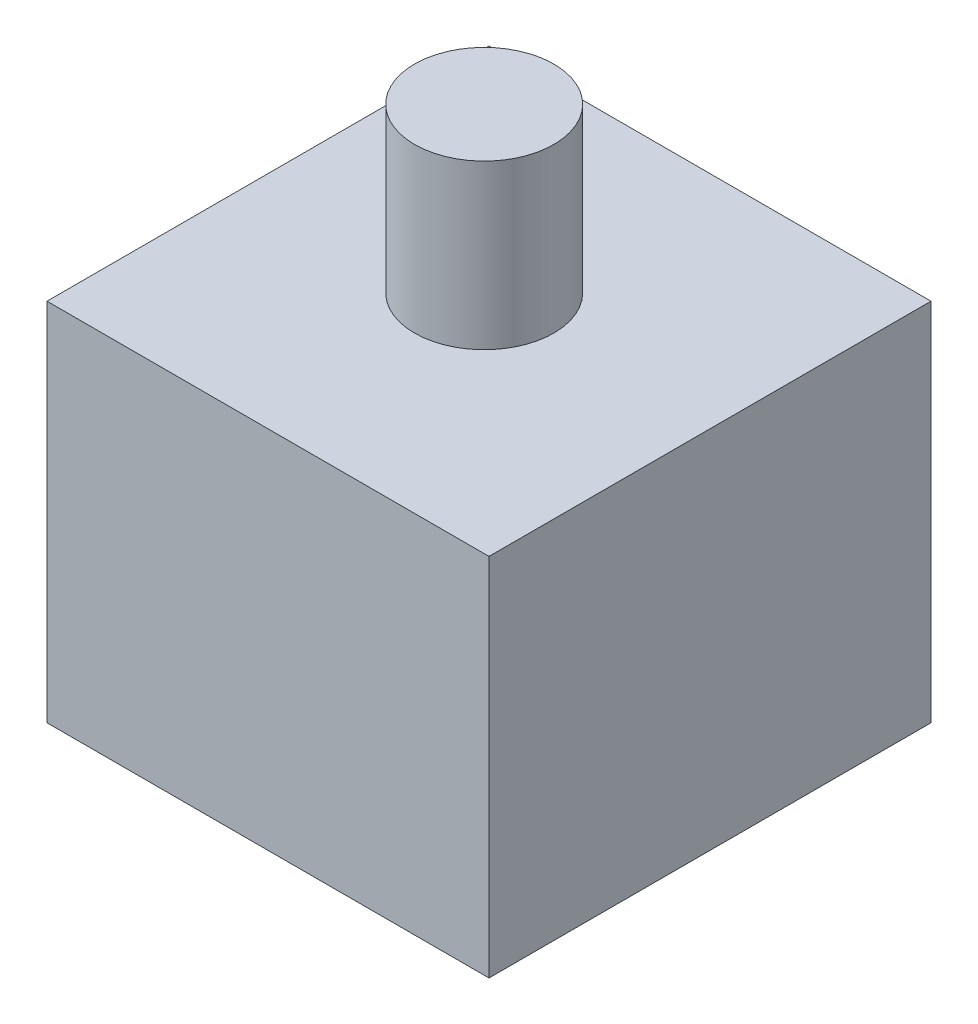
ISO-10303-21;
HEADER;
FILE_DESCRIPTION(('STEP AP214'),'2;1');
FILE_NAME('part.step','',(''),(''),'','','');
FILE_SCHEMA(('AUTOMOTIVE_DESIGN { 1 0 10303 214 1 1 1 1 }'));
ENDSEC;
DATA;
#1=APPLICATION_CONTEXT('core data for automotive mechanical design processes');
#2=APPLICATION_PROTOCOL_DEFINITION('international standard','automotive_design',2000,#1);
#3=PRODUCT_CONTEXT('',#1,'mechanical');
#4=PRODUCT('Part','Part','',(#3));
#5=PRODUCT_RELATED_PRODUCT_CATEGORY('part','',(#4));
#6=PRODUCT_DEFINITION_FORMATION('','',#4);
#7=PRODUCT_DEFINITION_CONTEXT('part definition',#1,'design');
#8=PRODUCT_DEFINITION('design','',#6,#7);
#9=PRODUCT_DEFINITION_SHAPE('','',#8);
#10=(LENGTH_UNIT() NAMED_UNIT(*) SI_UNIT(.MILLI.,.METRE.));
#11=(NAMED_UNIT(*) PLANE_ANGLE_UNIT() SI_UNIT($,.RADIAN.));
#12=(NAMED_UNIT(*) SI_UNIT($,.STERADIAN.) SOLID_ANGLE_UNIT());
#13=UNCERTAINTY_MEASURE_WITH_UNIT(LENGTH_MEASURE(1.E-05),#10,'distance_accuracy_value','');
#14=(GEOMETRIC_REPRESENTATION_CONTEXT(3) GLOBAL_UNCERTAINTY_ASSIGNED_CONTEXT((#13)) GLOBAL_UNIT_ASSIGNED_CONTEXT((#10,
#11,#12)) REPRESENTATION_CONTEXT('',''));
#15=CARTESIAN_POINT('',(0.,0.,0.));
#16=DIRECTION('',(0.,0.,1.));
#17=DIRECTION('',(1.,0.,0.));
#18=AXIS2_PLACEMENT_3D('',#15,#16,#17);
#19=CARTESIAN_POINT('',(-31.4333333333333,38.,-27.0633333333333));
#20=DIRECTION('',(-1.,0.,0.));
#21=DIRECTION('',(0.,0.,1.));
#22=AXIS2_PLACEMENT_3D('',#19,#20,#21);
#23=PLANE('',#22);
#24=DIRECTION('',(0.,0.,-1.));
#25=VECTOR('',#24,1.);
#26=CARTESIAN_POINT('',(-31.4333333333333,0.,-27.0633333333333));
#27=LINE('',#26,#25);
#28=CARTESIAN_POINT('',(-31.4333333333333,0.,18.9366666666667));
#29=VERTEX_POINT('',#28);
#30=CARTESIAN_POINT('',(-31.4333333333333,0.,-27.0633333333333));
#31=VERTEX_POINT('',#30);
#32=EDGE_CURVE('E99',#29,#31,#27,.T.);
#33=ORIENTED_EDGE('',*,*,#32,.T.);
#34=DIRECTION('',(0.,-1.,0.));
#35=VECTOR('',#34,1.);
#36=CARTESIAN_POINT('',(-31.4333333333333,38.,-27.0633333333333));
#37=LINE('',#36,#35);
#38=CARTESIAN_POINT('',(-31.4333333333333,38.,-27.0633333333333));
#39=VERTEX_POINT('',#38);
#40=EDGE_CURVE('E36',#39,#31,#37,.T.);
#41=ORIENTED_EDGE('',*,*,#40,.F.);
#42=DIRECTION('',(0.,0.,-1.));
#43=VECTOR('',#42,1.);
#44=CARTESIAN_POINT('',(-31.4333333333333,38.,-27.0633333333333));
#45=LINE('',#44,#43);
#46=CARTESIAN_POINT('',(-31.4333333333333,38.,18.9366666666667));
#47=VERTEX_POINT('',#46);
#48=EDGE_CURVE('E86',#47,#39,#45,.T.);
#49=ORIENTED_EDGE('',*,*,#48,.F.);
#50=DIRECTION('',(0.,-1.,0.));
#51=VECTOR('',#50,1.);
#52=CARTESIAN_POINT('',(-31.4333333333333,38.,18.9366666666667));
#53=LINE('',#52,#51);
#54=EDGE_CURVE('E95',#47,#29,#53,.T.);
#55=ORIENTED_EDGE('',*,*,#54,.T.);
#56=EDGE_LOOP('',(#33,#41,#49,#55));
#57=FACE_BOUND('',#56,.T.);
#58=ADVANCED_FACE('F33',(#57),#23,.F.);
#59=CARTESIAN_POINT('',(-77.4333333333333,38.,-27.0633333333333));
#60=DIRECTION('',(0.,0.,1.));
#61=DIRECTION('',(1.,0.,0.));
#62=AXIS2_PLACEMENT_3D('',#59,#60,#61);
#63=PLANE('',#62);
#64=DIRECTION('',(-1.,0.,0.));
#65=VECTOR('',#64,1.);
#66=CARTESIAN_POINT('',(-77.4333333333333,0.,-27.0633333333333));
#67=LINE('',#66,#65);
#68=CARTESIAN_POINT('',(-77.4333333333333,0.,-27.0633333333333));
#69=VERTEX_POINT('',#68);
#70=EDGE_CURVE('E91',#31,#69,#67,.T.);
#71=ORIENTED_EDGE('',*,*,#70,.T.);
#72=DIRECTION('',(0.,-1.,0.));
#73=VECTOR('',#72,1.);
#74=CARTESIAN_POINT('',(-77.4333333333333,38.,-27.0633333333333));
#75=LINE('',#74,#73);
#76=CARTESIAN_POINT('',(-77.4333333333333,38.,-27.0633333333333));
#77=VERTEX_POINT('',#76);
#78=EDGE_CURVE('E89',#77,#69,#75,.T.);
#79=ORIENTED_EDGE('',*,*,#78,.F.);
#80=DIRECTION('',(-1.,0.,0.));
#81=VECTOR('',#80,1.);
#82=CARTESIAN_POINT('',(-77.4333333333333,38.,-27.0633333333333));
#83=LINE('',#82,#81);
#84=EDGE_CURVE('E81',#39,#77,#83,.T.);
#85=ORIENTED_EDGE('',*,*,#84,.F.);
#86=ORIENTED_EDGE('',*,*,#40,.T.);
#87=EDGE_LOOP('',(#71,#79,#85,#86));
#88=FACE_BOUND('',#87,.T.);
#89=ADVANCED_FACE('F90',(#88),#63,.F.);
#90=CARTESIAN_POINT('',(-77.4333333333333,38.,-27.0633333333333));
#91=DIRECTION('',(1.,0.,0.));
#92=DIRECTION('',(0.,0.,-1.));
#93=AXIS2_PLACEMENT_3D('',#90,#91,#92);
#94=PLANE('',#93);
#95=DIRECTION('',(0.,0.,1.));
#96=VECTOR('',#95,1.);
#97=CARTESIAN_POINT('',(-77.4333333333333,0.,-27.0633333333333));
#98=LINE('',#97,#96);
#99=CARTESIAN_POINT('',(-77.4333333333333,0.,18.9366666666667));
#100=VERTEX_POINT('',#99);
#101=EDGE_CURVE('E67',#69,#100,#98,.T.);
#102=ORIENTED_EDGE('',*,*,#101,.T.);
#103=DIRECTION('',(0.,-1.,0.));
#104=VECTOR('',#103,1.);
#105=CARTESIAN_POINT('',(-77.4333333333333,38.,18.9366666666667));
#106=LINE('',#105,#104);
#107=CARTESIAN_POINT('',(-77.4333333333333,38.,18.9366666666667));
#108=VERTEX_POINT('',#107);
#109=EDGE_CURVE('E92',#108,#100,#106,.T.);
#110=ORIENTED_EDGE('',*,*,#109,.F.);
#111=DIRECTION('',(0.,0.,1.));
#112=VECTOR('',#111,1.);
#113=CARTESIAN_POINT('',(-77.4333333333333,38.,-27.0633333333333));
#114=LINE('',#113,#112);
#115=EDGE_CURVE('E84',#77,#108,#114,.T.);
#116=ORIENTED_EDGE('',*,*,#115,.F.);
#117=ORIENTED_EDGE('',*,*,#78,.T.);
#118=EDGE_LOOP('',(#102,#110,#116,#117));
#119=FACE_BOUND('',#118,.T.);
#120=ADVANCED_FACE('F93',(#119),#94,.F.);
#121=CARTESIAN_POINT('',(-77.4333333333333,38.,18.9366666666667));
#122=DIRECTION('',(0.,0.,-1.));
#123=DIRECTION('',(-1.,0.,0.));
#124=AXIS2_PLACEMENT_3D('',#121,#122,#123);
#125=PLANE('',#124);
#126=DIRECTION('',(1.,0.,0.));
#127=VECTOR('',#126,1.);
#128=CARTESIAN_POINT('',(-77.4333333333333,0.,18.9366666666667));
#129=LINE('',#128,#127);
#130=EDGE_CURVE('E73',#100,#29,#129,.T.);
#131=ORIENTED_EDGE('',*,*,#130,.T.);
#132=ORIENTED_EDGE('',*,*,#54,.F.);
#133=DIRECTION('',(1.,0.,0.));
#134=VECTOR('',#133,1.);
#135=CARTESIAN_POINT('',(-77.4333333333333,38.,18.9366666666667));
#136=LINE('',#135,#134);
#137=EDGE_CURVE('E50',#108,#47,#136,.T.);
#138=ORIENTED_EDGE('',*,*,#137,.F.);
#139=ORIENTED_EDGE('',*,*,#109,.T.);
#140=EDGE_LOOP('',(#131,#132,#138,#139));
#141=FACE_BOUND('',#140,.T.);
#142=ADVANCED_FACE('F107',(#141),#125,.F.);
#143=CARTESIAN_POINT('',(0.,38.,0.));
#144=DIRECTION('',(0.,1.,0.));
#145=DIRECTION('',(0.,0.,1.));
#146=AXIS2_PLACEMENT_3D('',#143,#144,#145);
#147=PLANE('',#146);
#148=CARTESIAN_POINT('',(-55.4333333333333,38.,-4.56333333333335));
#149=DIRECTION('',(0.,1.,0.));
#150=DIRECTION('',(0.,0.,1.));
#151=AXIS2_PLACEMENT_3D('',#148,#149,#150);
#152=CIRCLE('',#151,7.25);
#153=CARTESIAN_POINT('',(-55.4333333333333,38.,2.68666666666665));
#154=VERTEX_POINT('',#153);
#155=EDGE_CURVE('E11',#154,#154,#152,.T.);
#156=ORIENTED_EDGE('',*,*,#155,.F.);
#157=EDGE_LOOP('',(#156));
#158=FACE_BOUND('',#157,.T.);
#159=ORIENTED_EDGE('',*,*,#48,.T.);
#160=ORIENTED_EDGE('',*,*,#84,.T.);
#161=ORIENTED_EDGE('',*,*,#115,.T.);
#162=ORIENTED_EDGE('',*,*,#137,.T.);
#163=EDGE_LOOP('',(#159,#160,#161,#162));
#164=FACE_BOUND('',#163,.T.);
#165=ADVANCED_FACE('F82',(#158,#164),#147,.T.);
#166=CARTESIAN_POINT('',(0.,0.,0.));
#167=DIRECTION('',(0.,1.,0.));
#168=DIRECTION('',(0.,0.,1.));
#169=AXIS2_PLACEMENT_3D('',#166,#167,#168);
#170=PLANE('',#169);
#171=ORIENTED_EDGE('',*,*,#32,.F.);
#172=ORIENTED_EDGE('',*,*,#130,.F.);
#173=ORIENTED_EDGE('',*,*,#101,.F.);
#174=ORIENTED_EDGE('',*,*,#70,.F.);
#175=EDGE_LOOP('',(#171,#172,#173,#174));
#176=FACE_BOUND('',#175,.T.);
#177=ADVANCED_FACE('F110',(#176),#170,.F.);
#178=CARTESIAN_POINT('',(-55.4333333333333,55.,-4.56333333333335));
#179=DIRECTION('',(0.,-1.,0.));
#180=DIRECTION('',(0.,0.,-1.));
#181=AXIS2_PLACEMENT_3D('',#178,#179,#180);
#182=CYLINDRICAL_SURFACE('',#181,7.25);
#183=CARTESIAN_POINT('',(-55.4333333333333,55.,-4.56333333333335));
#184=DIRECTION('',(0.,1.,0.));
#185=DIRECTION('',(0.,0.,1.));
#186=AXIS2_PLACEMENT_3D('',#183,#184,#185);
#187=CIRCLE('',#186,7.25);
#188=CARTESIAN_POINT('',(-55.4333333333333,55.,2.68666666666665));
#189=VERTEX_POINT('',#188);
#190=EDGE_CURVE('E102',#189,#189,#187,.T.);
#191=ORIENTED_EDGE('',*,*,#190,.F.);
#192=EDGE_LOOP('',(#191));
#193=FACE_BOUND('',#192,.T.);
#194=ORIENTED_EDGE('',*,*,#155,.T.);
#195=EDGE_LOOP('',(#194));
#196=FACE_BOUND('',#195,.T.);
#197=ADVANCED_FACE('F118',(#193,#196),#182,.T.);
#198=CARTESIAN_POINT('',(-55.4333333333333,55.,-4.56333333333335));
#199=DIRECTION('',(0.,1.,0.));
#200=DIRECTION('',(0.,0.,1.));
#201=AXIS2_PLACEMENT_3D('',#198,#199,#200);
#202=PLANE('',#201);
#203=ORIENTED_EDGE('',*,*,#190,.T.);
#204=EDGE_LOOP('',(#203));
#205=FACE_BOUND('',#204,.T.);
#206=ADVANCED_FACE('F116',(#205),#202,.T.);
#207=CLOSED_SHELL('',(#58,#89,#120,#142,#165,#177,#197,#206));
#208=MANIFOLD_SOLID_BREP('B2',#207);
#209=ADVANCED_BREP_SHAPE_REPRESENTATION('',(#18,#208),#14);
#210=SHAPE_DEFINITION_REPRESENTATION(#9,#209);
ENDSEC;
END-ISO-10303-21;
